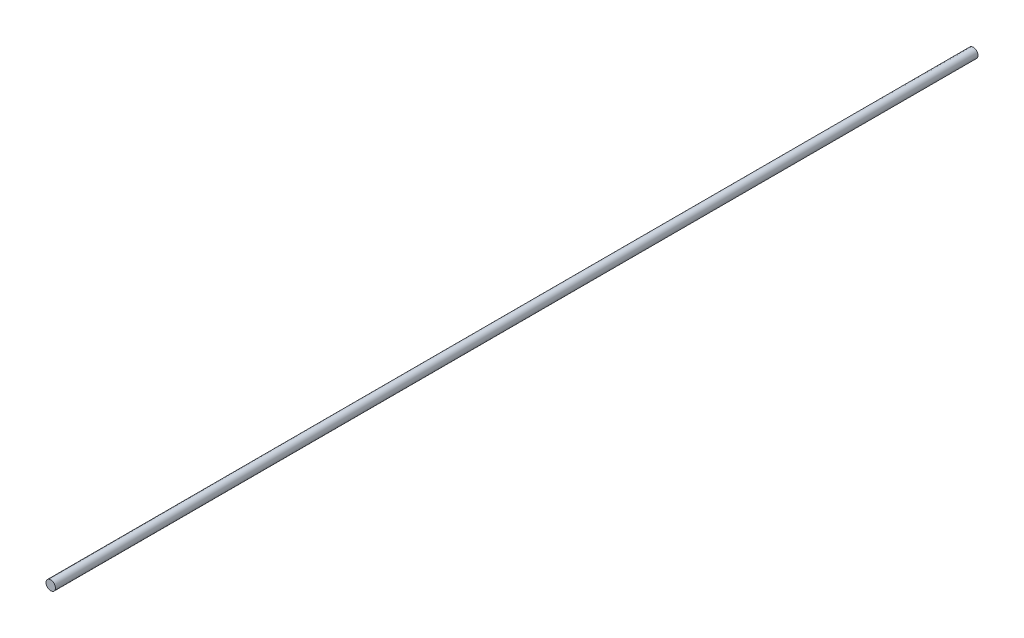
ISO-10303-21;
HEADER;
FILE_DESCRIPTION(('STEP AP214'),'2;1');
FILE_NAME('part.step','',(''),(''),'','','');
FILE_SCHEMA(('AUTOMOTIVE_DESIGN { 1 0 10303 214 1 1 1 1 }'));
ENDSEC;
DATA;
#1=APPLICATION_CONTEXT('core data for automotive mechanical design processes');
#2=APPLICATION_PROTOCOL_DEFINITION('international standard','automotive_design',2000,#1);
#3=PRODUCT_CONTEXT('',#1,'mechanical');
#4=PRODUCT('Part','Part','',(#3));
#5=PRODUCT_RELATED_PRODUCT_CATEGORY('part','',(#4));
#6=PRODUCT_DEFINITION_FORMATION('','',#4);
#7=PRODUCT_DEFINITION_CONTEXT('part definition',#1,'design');
#8=PRODUCT_DEFINITION('design','',#6,#7);
#9=PRODUCT_DEFINITION_SHAPE('','',#8);
#10=(LENGTH_UNIT() NAMED_UNIT(*) SI_UNIT(.MILLI.,.METRE.));
#11=(NAMED_UNIT(*) PLANE_ANGLE_UNIT() SI_UNIT($,.RADIAN.));
#12=(NAMED_UNIT(*) SI_UNIT($,.STERADIAN.) SOLID_ANGLE_UNIT());
#13=UNCERTAINTY_MEASURE_WITH_UNIT(LENGTH_MEASURE(1.E-05),#10,'distance_accuracy_value','');
#14=(GEOMETRIC_REPRESENTATION_CONTEXT(3) GLOBAL_UNCERTAINTY_ASSIGNED_CONTEXT((#13)) GLOBAL_UNIT_ASSIGNED_CONTEXT((#10,
#11,#12)) REPRESENTATION_CONTEXT('',''));
#15=CARTESIAN_POINT('',(0.,0.,0.));
#16=DIRECTION('',(0.,0.,1.));
#17=DIRECTION('',(1.,0.,0.));
#18=AXIS2_PLACEMENT_3D('',#15,#16,#17);
#19=CARTESIAN_POINT('',(0.,0.,195.));
#20=DIRECTION('',(0.,0.,-1.));
#21=DIRECTION('',(-1.,0.,0.));
#22=AXIS2_PLACEMENT_3D('',#19,#20,#21);
#23=CYLINDRICAL_SURFACE('',#22,1.);
#24=CARTESIAN_POINT('',(0.,0.,195.));
#25=DIRECTION('',(0.,0.,1.));
#26=DIRECTION('',(1.,0.,0.));
#27=AXIS2_PLACEMENT_3D('',#24,#25,#26);
#28=CIRCLE('',#27,1.);
#29=CARTESIAN_POINT('',(1.,0.,195.));
#30=VERTEX_POINT('',#29);
#31=EDGE_CURVE('E10',#30,#30,#28,.T.);
#32=ORIENTED_EDGE('',*,*,#31,.F.);
#33=EDGE_LOOP('',(#32));
#34=FACE_BOUND('',#33,.T.);
#35=CARTESIAN_POINT('',(0.,0.,0.));
#36=DIRECTION('',(0.,0.,1.));
#37=DIRECTION('',(1.,0.,0.));
#38=AXIS2_PLACEMENT_3D('',#35,#36,#37);
#39=CIRCLE('',#38,1.);
#40=CARTESIAN_POINT('',(1.,0.,0.));
#41=VERTEX_POINT('',#40);
#42=EDGE_CURVE('E33',#41,#41,#39,.T.);
#43=ORIENTED_EDGE('',*,*,#42,.T.);
#44=EDGE_LOOP('',(#43));
#45=FACE_BOUND('',#44,.T.);
#46=ADVANCED_FACE('F30',(#34,#45),#23,.T.);
#47=CARTESIAN_POINT('',(0.,0.,195.));
#48=DIRECTION('',(0.,0.,1.));
#49=DIRECTION('',(1.,0.,0.));
#50=AXIS2_PLACEMENT_3D('',#47,#48,#49);
#51=PLANE('',#50);
#52=ORIENTED_EDGE('',*,*,#31,.T.);
#53=EDGE_LOOP('',(#52));
#54=FACE_BOUND('',#53,.T.);
#55=ADVANCED_FACE('F45',(#54),#51,.T.);
#56=CARTESIAN_POINT('',(0.,0.,0.));
#57=DIRECTION('',(0.,0.,1.));
#58=DIRECTION('',(1.,0.,0.));
#59=AXIS2_PLACEMENT_3D('',#56,#57,#58);
#60=PLANE('',#59);
#61=ORIENTED_EDGE('',*,*,#42,.F.);
#62=EDGE_LOOP('',(#61));
#63=FACE_BOUND('',#62,.T.);
#64=ADVANCED_FACE('F43',(#63),#60,.F.);
#65=CLOSED_SHELL('',(#46,#55,#64));
#66=MANIFOLD_SOLID_BREP('B2',#65);
#67=ADVANCED_BREP_SHAPE_REPRESENTATION('',(#18,#66),#14);
#68=SHAPE_DEFINITION_REPRESENTATION(#9,#67);
ENDSEC;
END-ISO-10303-21;
